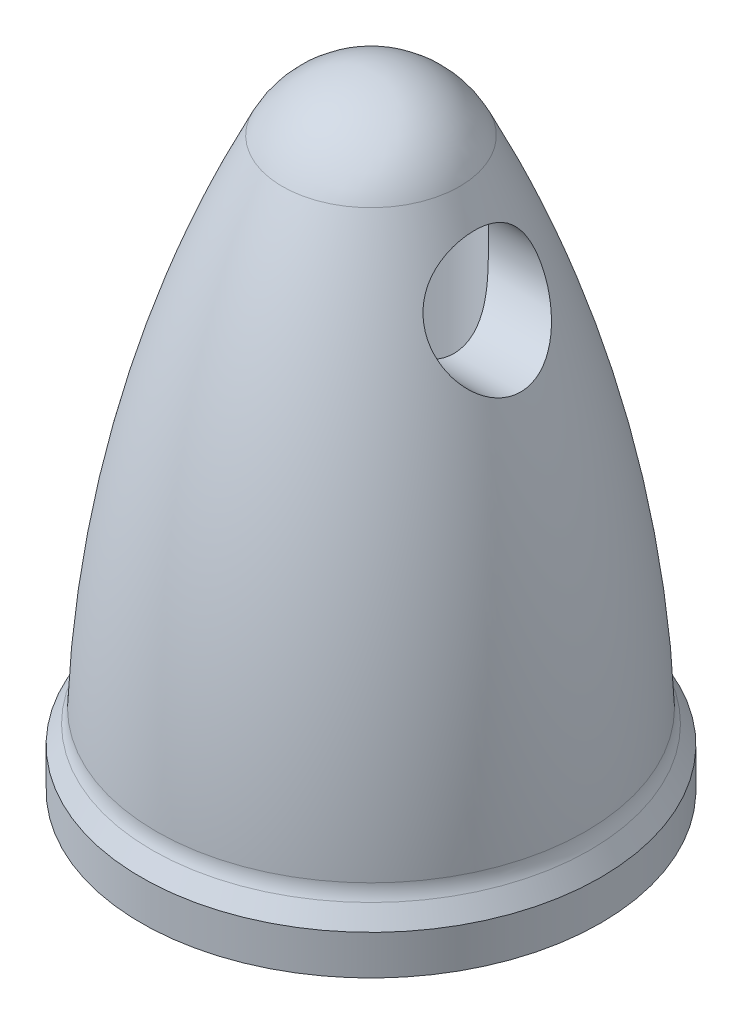
ISO-10303-21;
HEADER;
FILE_DESCRIPTION(('STEP AP214'),'2;1');
FILE_NAME('part.step','',(''),(''),'','','');
FILE_SCHEMA(('AUTOMOTIVE_DESIGN { 1 0 10303 214 1 1 1 1 }'));
ENDSEC;
DATA;
#1=APPLICATION_CONTEXT('core data for automotive mechanical design processes');
#2=APPLICATION_PROTOCOL_DEFINITION('international standard','automotive_design',2000,#1);
#3=PRODUCT_CONTEXT('',#1,'mechanical');
#4=PRODUCT('Part','Part','',(#3));
#5=PRODUCT_RELATED_PRODUCT_CATEGORY('part','',(#4));
#6=PRODUCT_DEFINITION_FORMATION('','',#4);
#7=PRODUCT_DEFINITION_CONTEXT('part definition',#1,'design');
#8=PRODUCT_DEFINITION('design','',#6,#7);
#9=PRODUCT_DEFINITION_SHAPE('','',#8);
#10=(LENGTH_UNIT() NAMED_UNIT(*) SI_UNIT(.MILLI.,.METRE.));
#11=(NAMED_UNIT(*) PLANE_ANGLE_UNIT() SI_UNIT($,.RADIAN.));
#12=(NAMED_UNIT(*) SI_UNIT($,.STERADIAN.) SOLID_ANGLE_UNIT());
#13=UNCERTAINTY_MEASURE_WITH_UNIT(LENGTH_MEASURE(1.E-05),#10,'distance_accuracy_value','');
#14=(GEOMETRIC_REPRESENTATION_CONTEXT(3) GLOBAL_UNCERTAINTY_ASSIGNED_CONTEXT((#13)) GLOBAL_UNIT_ASSIGNED_CONTEXT((#10,
#11,#12)) REPRESENTATION_CONTEXT('',''));
#15=CARTESIAN_POINT('',(0.,0.,0.));
#16=DIRECTION('',(0.,0.,1.));
#17=DIRECTION('',(1.,0.,0.));
#18=AXIS2_PLACEMENT_3D('',#15,#16,#17);
#19=CARTESIAN_POINT('',(5.9055,0.,0.));
#20=DIRECTION('',(0.,-1.,0.));
#21=DIRECTION('',(1.,0.,0.));
#22=AXIS2_PLACEMENT_3D('',#19,#20,#21);
#23=PLANE('',#22);
#24=CARTESIAN_POINT('',(0.,0.,0.));
#25=DIRECTION('',(0.,-1.,0.));
#26=DIRECTION('',(1.,0.,0.));
#27=AXIS2_PLACEMENT_3D('',#24,#25,#26);
#28=CIRCLE('',#27,2.1336);
#29=CARTESIAN_POINT('',(2.1336,0.,0.));
#30=VERTEX_POINT('',#29);
#31=EDGE_CURVE('E142',#30,#30,#28,.T.);
#32=ORIENTED_EDGE('',*,*,#31,.F.);
#33=EDGE_LOOP('',(#32));
#34=FACE_BOUND('',#33,.T.);
#35=CARTESIAN_POINT('',(0.,0.,0.));
#36=DIRECTION('',(0.,-1.,0.));
#37=DIRECTION('',(1.,0.,0.));
#38=AXIS2_PLACEMENT_3D('',#35,#36,#37);
#39=CIRCLE('',#38,5.9055);
#40=CARTESIAN_POINT('',(5.9055,0.,0.));
#41=VERTEX_POINT('',#40);
#42=EDGE_CURVE('E145',#41,#41,#39,.T.);
#43=ORIENTED_EDGE('',*,*,#42,.T.);
#44=EDGE_LOOP('',(#43));
#45=FACE_BOUND('',#44,.T.);
#46=ADVANCED_FACE('F34',(#34,#45),#23,.T.);
#47=CARTESIAN_POINT('',(0.,13.462,0.));
#48=DIRECTION('',(0.,-1.,0.));
#49=DIRECTION('',(1.,0.,0.));
#50=AXIS2_PLACEMENT_3D('',#47,#48,#49);
#51=SPHERICAL_SURFACE('',#50,2.54);
#52=CARTESIAN_POINT('',(0.,14.5837998509104,0.));
#53=DIRECTION('',(0.,-1.,0.));
#54=DIRECTION('',(1.,0.,0.));
#55=AXIS2_PLACEMENT_3D('',#52,#53,#54);
#56=CIRCLE('',#55,2.27885170524483);
#57=CARTESIAN_POINT('',(2.27885170524483,14.5837998509104,0.));
#58=VERTEX_POINT('',#57);
#59=EDGE_CURVE('E80',#58,#58,#56,.T.);
#60=ORIENTED_EDGE('',*,*,#59,.F.);
#61=EDGE_LOOP('',(#60));
#62=FACE_BOUND('',#61,.T.);
#63=ADVANCED_FACE('F129',(#62),#51,.T.);
#64=CARTESIAN_POINT('',(0.,0.5613017145298,0.));
#65=DIRECTION('',(0.,-1.,0.));
#66=DIRECTION('',(1.,0.,0.));
#67=AXIS2_PLACEMENT_3D('',#64,#65,#66);
#68=DEGENERATE_TOROIDAL_SURFACE('',#67,26.2067946103156,31.75,.F.);
#69=CARTESIAN_POINT('',(0.,1.84435599321783,0.));
#70=DIRECTION('',(0.,-1.,0.));
#71=DIRECTION('',(1.,0.,0.));
#72=AXIS2_PLACEMENT_3D('',#69,#70,#71);
#73=CIRCLE('',#72,5.51726994197562);
#74=CARTESIAN_POINT('',(5.51726994197562,1.84435599321783,0.));
#75=VERTEX_POINT('',#74);
#76=EDGE_CURVE('E11',#75,#75,#73,.F.);
#77=ORIENTED_EDGE('',*,*,#76,.T.);
#78=EDGE_LOOP('',(#77));
#79=FACE_BOUND('',#78,.T.);
#80=CARTESIAN_POINT('',(-3.70623269568227,10.9934441874173,-0.74524960081367));
#81=CARTESIAN_POINT('',(-3.73049608134938,10.959059643441,-0.685259641541336));
#82=CARTESIAN_POINT('',(-3.75236292432251,10.9283959647508,-0.622126243018675));
#83=CARTESIAN_POINT('',(-3.79007960465615,10.8758056169061,-0.490585599003258));
#84=CARTESIAN_POINT('',(-3.80592919200305,10.8538793107826,-0.422178134518042));
#85=CARTESIAN_POINT('',(-3.83059439940226,10.8198582353664,-0.281344743460196));
#86=CARTESIAN_POINT('',(-3.8393762261214,10.8078106946583,-0.208901261204926));
#87=CARTESIAN_POINT('',(-3.84907852012478,10.7945042438503,-0.0625191035997228));
#88=CARTESIAN_POINT('',(-3.85000232163198,10.7932407579889,0.0114189242523278));
#89=CARTESIAN_POINT('',(-3.8441177437748,10.8013069173333,0.1536890916008));
#90=CARTESIAN_POINT('',(-3.83779304795704,10.8099739049219,0.222080833461416));
#91=CARTESIAN_POINT('',(-3.81864135282714,10.8363314038793,0.356145987324716));
#92=CARTESIAN_POINT('',(-3.80581325969164,10.8540234331966,0.421818940036647));
#93=CARTESIAN_POINT('',(-3.7741457680848,10.8979830494787,0.550234335295119));
#94=CARTESIAN_POINT('',(-3.75518917668342,10.9244180731983,0.612889766317368));
#95=CARTESIAN_POINT('',(-3.71239785323472,10.9846327574839,0.732742007723939));
#96=CARTESIAN_POINT('',(-3.68856124177456,11.0184152480493,0.789936702566209));
#97=CARTESIAN_POINT('',(-3.63348375237681,11.0973853394872,0.905786273310927));
#98=CARTESIAN_POINT('',(-3.60167383305462,11.1435065707108,0.963531578398175));
#99=CARTESIAN_POINT('',(-3.53458513698183,11.2424591916715,1.07062074615817));
#100=CARTESIAN_POINT('',(-3.49930440810702,11.2952943625299,1.11995983772641));
#101=CARTESIAN_POINT('',(-3.41983123325909,11.4169143714163,1.21837134791156));
#102=CARTESIAN_POINT('',(-3.37520181009775,11.4868379354967,1.26568709712471));
#103=CARTESIAN_POINT('',(-3.28492444164431,11.6331538195193,1.34783692710971));
#104=CARTESIAN_POINT('',(-3.23927535518789,11.7095536852432,1.38265619362951));
#105=CARTESIAN_POINT('',(-3.14309562627013,11.8778787133646,1.44290416659573));
#106=CARTESIAN_POINT('',(-3.09269804867417,11.9705333533547,1.46653371711431));
#107=CARTESIAN_POINT('',(-2.99621160130431,12.1607956487225,1.49579467880649));
#108=CARTESIAN_POINT('',(-2.95011763920919,12.2583972339247,1.5014476299192));
#109=CARTESIAN_POINT('',(-2.875008871208,12.4337909209052,1.49399570561933));
#110=CARTESIAN_POINT('',(-2.84448412873526,12.5111032505574,1.48482235127097));
#111=CARTESIAN_POINT('',(-2.78942608614919,12.6653315952335,1.45388657766073));
#112=CARTESIAN_POINT('',(-2.76488645528343,12.7422479440362,1.43213754315653));
#113=CARTESIAN_POINT('',(-2.72265505050117,12.8936050871113,1.37562575686052));
#114=CARTESIAN_POINT('',(-2.7049957173408,12.968032676436,1.34080283914222));
#115=CARTESIAN_POINT('',(-2.67674138250933,13.111133527504,1.25866723872396));
#116=CARTESIAN_POINT('',(-2.66614689882834,13.1798063669902,1.2113536405705));
#117=CARTESIAN_POINT('',(-2.65153080721651,13.3038804010098,1.10954765288609));
#118=CARTESIAN_POINT('',(-2.64707897992551,13.3598887802364,1.05585081277077));
#119=CARTESIAN_POINT('',(-2.64188214202105,13.4630128947196,0.940357057513348));
#120=CARTESIAN_POINT('',(-2.64113784823812,13.5101269086072,0.87855857833569));
#121=CARTESIAN_POINT('',(-2.64175812499166,13.5959025579871,0.745853762444374));
#122=CARTESIAN_POINT('',(-2.64320754773788,13.6341546187085,0.674683326670559));
#123=CARTESIAN_POINT('',(-2.64671455201356,13.6987387531446,0.527138518866886));
#124=CARTESIAN_POINT('',(-2.64877221549671,13.7250692193458,0.450763446637889));
#125=CARTESIAN_POINT('',(-2.65231915058036,13.7660144242633,0.291314644126676));
#126=CARTESIAN_POINT('',(-2.65377943680958,13.7800628357677,0.208094034813731));
#127=CARTESIAN_POINT('',(-2.65522852615118,13.794012863037,0.0404646099418215));
#128=CARTESIAN_POINT('',(-2.65521734187403,13.7939146000384,-0.0439441954281295));
#129=CARTESIAN_POINT('',(-2.65373165273767,13.77959322667,-0.211346696935822));
#130=CARTESIAN_POINT('',(-2.65226046317562,13.7654021174857,-0.29434316583753));
#131=CARTESIAN_POINT('',(-2.64862896402442,13.7233489517142,-0.456795458866497));
#132=CARTESIAN_POINT('',(-2.6464685139197,13.6954841069177,-0.536250557267413));
#133=CARTESIAN_POINT('',(-2.64288491525602,13.6267258067787,-0.689689371163243));
#134=CARTESIAN_POINT('',(-2.64146454587461,13.5857841596775,-0.763651581121133));
#135=CARTESIAN_POINT('',(-2.64129870828608,13.4920550159141,-0.903658929423185));
#136=CARTESIAN_POINT('',(-2.64255274477847,13.4392697143191,-0.96970553134681));
#137=CARTESIAN_POINT('',(-2.64974964241517,13.3243773303642,-1.09094675708557));
#138=CARTESIAN_POINT('',(-2.65562045762275,13.2624252586768,-1.14629198027818));
#139=CARTESIAN_POINT('',(-2.67360128141926,13.1308410958499,-1.24563865684058));
#140=CARTESIAN_POINT('',(-2.68570722044057,13.0612140373232,-1.28964748122903));
#141=CARTESIAN_POINT('',(-2.71600250963381,12.9212601341637,-1.36298142773331));
#142=CARTESIAN_POINT('',(-2.73378954049913,12.8512184424904,-1.39302128036502));
#143=CARTESIAN_POINT('',(-2.77534923117572,12.709027451596,-1.44183136674358));
#144=CARTESIAN_POINT('',(-2.79912369529522,12.6368775228634,-1.46059819759311));
#145=CARTESIAN_POINT('',(-2.85236129642253,12.4908710438938,-1.48745505152848));
#146=CARTESIAN_POINT('',(-2.88193868478271,12.4170120619696,-1.49529959549135));
#147=CARTESIAN_POINT('',(-2.94514904244868,12.2707169849442,-1.50021400909155));
#148=CARTESIAN_POINT('',(-2.97878343149048,12.1982813983287,-1.49728009619622));
#149=CARTESIAN_POINT('',(-3.05406360958885,12.045133337129,-1.4801578851183));
#150=CARTESIAN_POINT('',(-3.09615230543244,11.9648221295901,-1.4643374725628));
#151=CARTESIAN_POINT('',(-3.18205537732331,11.8085769324935,-1.42026577437626));
#152=CARTESIAN_POINT('',(-3.22587186892094,11.7326486083958,-1.39199878964765));
#153=CARTESIAN_POINT('',(-3.32014398865846,11.5749833238559,-1.31836438684951));
#154=CARTESIAN_POINT('',(-3.37058549738088,11.494145864747,-1.27103708361121));
#155=CARTESIAN_POINT('',(-3.46854368775008,11.3416358365627,-1.16119272817793));
#156=CARTESIAN_POINT('',(-3.51606531688715,11.2699475297518,-1.09870231091732));
#157=CARTESIAN_POINT('',(-3.58752863002465,11.1642875130128,-0.986818420753422));
#158=CARTESIAN_POINT('',(-3.61334947457711,11.1266305103391,-0.942054473100007));
#159=CARTESIAN_POINT('',(-3.66213048316383,11.056189536343,-0.84740490926137));
#160=CARTESIAN_POINT('',(-3.68509133170212,11.0234043986371,-0.797520523822136));
#161=CARTESIAN_POINT('',(-3.70623269568227,10.9934441874173,-0.74524960081367));
#162=B_SPLINE_CURVE_WITH_KNOTS('',3,(#80,#81,#82,#83,#84,#85,#86,#87,#88,#89,#90,#91,#92,#93,
#94,#95,#96,#97,#98,#99,#100,#101,#102,#103,#104,#105,#106,#107,#108,#109,#110,#111,#112,#113,
#114,#115,#116,#117,#118,#119,#120,#121,#122,#123,#124,#125,#126,#127,#128,#129,#130,#131,#132,
#133,#134,#135,#136,#137,#138,#139,#140,#141,#142,#143,#144,#145,#146,#147,#148,#149,#150,#151,
#152,#153,#154,#155,#156,#157,#158,#159,#160,#161),.UNSPECIFIED.,.T.,.F.,(4,2,2,2,2,2,2,2,2,2,2,
2,2,2,2,2,2,2,2,2,2,2,2,2,2,2,2,2,2,2,2,2,2,2,2,2,2,2,2,2,4),(0.,0.21965264765468,
0.439314420755886,0.660020332741697,0.880632592769666,1.08733982869276,1.29408184278535,
1.50503765856381,1.71607487184007,1.95655531371124,2.197171793354,2.48254465708769,
2.7682547140296,3.09095103912461,3.41326055672573,3.66310627316877,3.912686557858,
4.16342977557493,4.4141913755981,4.6463042575775,4.87846201552169,5.11983185553972,
5.36123423229465,5.61325589522014,5.86527539832566,6.11672393626907,6.36822376836555,
6.62066135590659,6.87305219601767,7.1215807428551,7.36994728417743,7.60361864145233,
7.83736049983916,8.07627528000054,8.31527391161513,8.59035207817698,8.86577820439709,
9.18351503431909,9.50069772987495,9.69213310798325,9.88352258004543),.UNSPECIFIED.);
#163=CARTESIAN_POINT('',(-3.70623269568227,10.9934441874173,-0.74524960081367));
#164=VERTEX_POINT('',#163);
#165=EDGE_CURVE('E119',#164,#164,#162,.T.);
#166=ORIENTED_EDGE('',*,*,#165,.F.);
#167=EDGE_LOOP('',(#166));
#168=FACE_BOUND('',#167,.T.);
#169=CARTESIAN_POINT('',(2.66691545767767,13.1801519294185,-1.20823327070742));
#170=CARTESIAN_POINT('',(2.65758141898724,13.245414467892,-1.16033980400675));
#171=CARTESIAN_POINT('',(2.65129254478436,13.3071096890096,-1.10689549104737));
#172=CARTESIAN_POINT('',(2.64334367152019,13.421175965974,-0.990474317539043));
#173=CARTESIAN_POINT('',(2.6416905957235,13.4735329667251,-0.927483347382761));
#174=CARTESIAN_POINT('',(2.64114664077394,13.5671714084083,-0.79400559412982));
#175=CARTESIAN_POINT('',(2.64224833220367,13.6084823071343,-0.723539462081165));
#176=CARTESIAN_POINT('',(2.64542383009648,13.67910821485,-0.576883110773673));
#177=CARTESIAN_POINT('',(2.64749742797203,13.7084257952809,-0.500694122681172));
#178=CARTESIAN_POINT('',(2.6512729076881,13.7550371787799,-0.342113930511586));
#179=CARTESIAN_POINT('',(2.65296118403541,13.7719275933151,-0.259603413284963));
#180=CARTESIAN_POINT('',(2.65496944311631,13.791670672802,-0.0929036099859381));
#181=CARTESIAN_POINT('',(2.6552894411704,13.7945234949316,-0.00871434272096894));
#182=CARTESIAN_POINT('',(2.65440399798543,13.7861074309606,0.15897788734177));
#183=CARTESIAN_POINT('',(2.65319798834581,13.7748332829243,0.24248058274551));
#184=CARTESIAN_POINT('',(2.64987536349743,13.7384798859327,0.406418148723955));
#185=CARTESIAN_POINT('',(2.6477585736147,13.7133979886006,0.486852427599438));
#186=CARTESIAN_POINT('',(2.64392011711497,13.6500575146313,0.642578073538787));
#187=CARTESIAN_POINT('',(2.64219934821893,13.6117694827445,0.717857489367314));
#188=CARTESIAN_POINT('',(2.64100214493266,13.5230914940665,0.860949461401389));
#189=CARTESIAN_POINT('',(2.64152550816178,13.4727026289411,0.928762690357967));
#190=CARTESIAN_POINT('',(2.64686067335808,13.3618899257772,1.05427419803627));
#191=CARTESIAN_POINT('',(2.65163003210993,13.3015702093084,1.11206583854484));
#192=CARTESIAN_POINT('',(2.6671799753391,13.1726675159763,1.21651666489281));
#193=CARTESIAN_POINT('',(2.67795634093979,13.1040903649947,1.26318363107576));
#194=CARTESIAN_POINT('',(2.70567179529704,12.9655330746371,1.34174459105477));
#195=CARTESIAN_POINT('',(2.72221163931588,12.8958720457204,1.37434540983927));
#196=CARTESIAN_POINT('',(2.76145072822521,12.7539481242027,1.42816172062623));
#197=CARTESIAN_POINT('',(2.78415137655534,12.6816846420164,1.4493746151609));
#198=CARTESIAN_POINT('',(2.83512765822185,12.53611785241,1.48073609250577));
#199=CARTESIAN_POINT('',(2.8634452917067,12.4628108291553,1.49079730924459));
#200=CARTESIAN_POINT('',(2.92434054314363,12.3173148883212,1.50018706261158));
#201=CARTESIAN_POINT('',(2.95691982465458,12.2451264197479,1.49951139556126));
#202=CARTESIAN_POINT('',(3.02986431688739,12.0929159153017,1.48733153360608));
#203=CARTESIAN_POINT('',(3.0706787375456,12.0132324574994,1.47430723606958));
#204=CARTESIAN_POINT('',(3.15433216689307,11.8579115801746,1.43610024615172));
#205=CARTESIAN_POINT('',(3.19717304535233,11.7822780401976,1.41090611943774));
#206=CARTESIAN_POINT('',(3.29007923072582,11.6242614810455,1.34398274395343));
#207=CARTESIAN_POINT('',(3.34019700763014,11.5427527872427,1.30024416093702));
#208=CARTESIAN_POINT('',(3.43818728387976,11.3882111436106,1.19777303821602));
#209=CARTESIAN_POINT('',(3.48606038236138,11.3151759243291,1.13904452681367));
#210=CARTESIAN_POINT('',(3.56934175964668,11.1908382721871,1.01783065010906));
#211=CARTESIAN_POINT('',(3.60551041184346,11.1379335068351,0.957514005248416));
#212=CARTESIAN_POINT('',(3.67239747446849,11.0413811683131,0.827225793290532));
#213=CARTESIAN_POINT('',(3.70312300938087,10.9977214794342,0.757267063296565));
#214=CARTESIAN_POINT('',(3.75288348904415,10.9276353720039,0.620400459187242));
#215=CARTESIAN_POINT('',(3.77299451180675,10.8995829237525,0.55471990446916));
#216=CARTESIAN_POINT('',(3.80667441759011,10.8528262858317,0.418506186692723));
#217=CARTESIAN_POINT('',(3.82024669194621,10.8341172499975,0.347975560872648));
#218=CARTESIAN_POINT('',(3.83990844806422,10.8070684894061,0.203574885799819));
#219=CARTESIAN_POINT('',(3.84596405151997,10.7987757096604,0.129691261967633));
#220=CARTESIAN_POINT('',(3.84997442913108,10.7932799195961,-0.0187045951438657));
#221=CARTESIAN_POINT('',(3.84793095803367,10.7960745070862,-0.0932166887681271));
#222=CARTESIAN_POINT('',(3.83639309894397,10.811906614975,-0.234646286725215));
#223=CARTESIAN_POINT('',(3.82748636680356,10.8241363596387,-0.301705879034334));
#224=CARTESIAN_POINT('',(3.80354098969213,10.8571843861555,-0.432510438368969));
#225=CARTESIAN_POINT('',(3.78850149198764,10.878003862377,-0.496254943056119));
#226=CARTESIAN_POINT('',(3.75234162540392,10.9284280085313,-0.622023351996065));
#227=CARTESIAN_POINT('',(3.73096905337064,10.9583990429281,-0.683826196433768));
#228=CARTESIAN_POINT('',(3.68360151703878,11.0255066350261,-0.801457116100382));
#229=CARTESIAN_POINT('',(3.65760444829766,11.0626464556421,-0.857282452573902));
#230=CARTESIAN_POINT('',(3.59779223396342,11.1492146141643,-0.970579120421979));
#231=CARTESIAN_POINT('',(3.56338986196171,11.1996553749255,-1.02696464241089));
#232=CARTESIAN_POINT('',(3.49146449777413,11.3071847963026,-1.13065229110317));
#233=CARTESIAN_POINT('',(3.45393966345653,11.3642773893038,-1.17794900052762));
#234=CARTESIAN_POINT('',(3.37008660200476,11.495047200206,-1.27109940108336));
#235=CARTESIAN_POINT('',(3.32341096817664,11.5698413109203,-1.31507887077776));
#236=CARTESIAN_POINT('',(3.22979178283414,11.7258154175257,-1.38956968978119));
#237=CARTESIAN_POINT('',(3.18284797252545,11.8070031496798,-1.42006441819166));
#238=CARTESIAN_POINT('',(3.08617816964643,11.9831161367176,-1.46921762843692));
#239=CARTESIAN_POINT('',(3.03666235698343,12.0785955897182,-1.48633683411298));
#240=CARTESIAN_POINT('',(2.943272504595,12.2737412535033,-1.50164697630567));
#241=CARTESIAN_POINT('',(2.89938953819462,12.3734004992534,-1.49986824578375));
#242=CARTESIAN_POINT('',(2.83051288937241,12.5484985772928,-1.47869279500378));
#243=CARTESIAN_POINT('',(2.80354509048575,12.6237183374766,-1.4638443866866));
#244=CARTESIAN_POINT('',(2.75581081547832,12.7726835675841,-1.42205239293433));
#245=CARTESIAN_POINT('',(2.73503192824855,12.8464317075864,-1.39513328932416));
#246=CARTESIAN_POINT('',(2.70650888635407,12.9638739486818,-1.34129380936888));
#247=CARTESIAN_POINT('',(2.69677199338774,13.008750166975,-1.31792913097191));
#248=CARTESIAN_POINT('',(2.67992312780911,13.09627638832,-1.26652639937526));
#249=CARTESIAN_POINT('',(2.67281172362075,13.1389259075728,-1.23848733606636));
#250=CARTESIAN_POINT('',(2.66691545767767,13.1801519294185,-1.20823327070742));
#251=B_SPLINE_CURVE_WITH_KNOTS('',3,(#169,#170,#171,#172,#173,#174,#175,#176,#177,#178,#179,
#180,#181,#182,#183,#184,#185,#186,#187,#188,#189,#190,#191,#192,#193,#194,#195,#196,#197,#198,
#199,#200,#201,#202,#203,#204,#205,#206,#207,#208,#209,#210,#211,#212,#213,#214,#215,#216,#217,
#218,#219,#220,#221,#222,#223,#224,#225,#226,#227,#228,#229,#230,#231,#232,#233,#234,#235,#236,
#237,#238,#239,#240,#241,#242,#243,#244,#245,#246,#247,#248,#249,#250),.UNSPECIFIED.,.T.,.F.,(4,
2,2,2,2,2,2,2,2,2,2,2,2,2,2,2,2,2,2,2,2,2,2,2,2,2,2,2,2,2,2,2,2,2,2,2,2,2,2,2,4),(0.,
0.244259639590767,0.488883871360142,0.732849080378543,0.976761954303432,1.22827976444181,
1.47979475834826,1.73140346302251,1.9830604439884,2.23528239522154,2.48748160101706,
2.73718776727473,2.98671877898239,3.22159019801918,3.45651516606174,3.69326788630453,
3.93011330167663,4.20050338873814,4.47114802018742,4.78537403913613,5.09951570363857,
5.36250723035323,5.62515194294633,5.84681376898409,6.06836050556148,6.29090218943141,
6.51339566000842,6.71870500554019,6.92404290815231,7.13901517404934,7.35408551754276,
7.6024881230262,7.8510383298046,8.14541963946029,8.4401627903699,8.76520955145166,
9.08973466089549,9.33255618248402,9.57488742474971,9.72915164855361,9.8834492513335),.UNSPECIFIED.);
#252=CARTESIAN_POINT('',(2.66691545767767,13.1801519294185,-1.20823327070742));
#253=VERTEX_POINT('',#252);
#254=EDGE_CURVE('E114',#253,#253,#251,.T.);
#255=ORIENTED_EDGE('',*,*,#254,.F.);
#256=EDGE_LOOP('',(#255));
#257=FACE_BOUND('',#256,.T.);
#258=ORIENTED_EDGE('',*,*,#59,.T.);
#259=EDGE_LOOP('',(#258));
#260=FACE_BOUND('',#259,.T.);
#261=ADVANCED_FACE('F123',(#79,#168,#257,#260),#68,.F.);
#262=CARTESIAN_POINT('',(0.,1.016,0.));
#263=DIRECTION('',(0.,-1.,0.));
#264=DIRECTION('',(1.,0.,0.));
#265=AXIS2_PLACEMENT_3D('',#262,#263,#264);
#266=CONICAL_SURFACE('',#265,5.9055,0.540419500270599);
#267=CARTESIAN_POINT('',(0.,1.48310353027056,0.));
#268=DIRECTION('',(0.,-1.,0.));
#269=DIRECTION('',(1.,0.,0.));
#270=AXIS2_PLACEMENT_3D('',#267,#268,#269);
#271=CIRCLE('',#270,5.62523788183766);
#272=CARTESIAN_POINT('',(5.62523788183765,1.48310353027056,0.));
#273=VERTEX_POINT('',#272);
#274=EDGE_CURVE('E42',#273,#273,#271,.T.);
#275=ORIENTED_EDGE('',*,*,#274,.T.);
#276=EDGE_LOOP('',(#275));
#277=FACE_BOUND('',#276,.T.);
#278=CARTESIAN_POINT('',(0.,1.016,0.));
#279=DIRECTION('',(0.,-1.,0.));
#280=DIRECTION('',(1.,0.,0.));
#281=AXIS2_PLACEMENT_3D('',#278,#279,#280);
#282=CIRCLE('',#281,5.9055);
#283=CARTESIAN_POINT('',(5.9055,1.016,0.));
#284=VERTEX_POINT('',#283);
#285=EDGE_CURVE('E147',#284,#284,#282,.T.);
#286=ORIENTED_EDGE('',*,*,#285,.F.);
#287=EDGE_LOOP('',(#286));
#288=FACE_BOUND('',#287,.T.);
#289=ADVANCED_FACE('F128',(#277,#288),#266,.T.);
#290=CARTESIAN_POINT('',(0.,16.002,0.));
#291=DIRECTION('',(0.,-1.,0.));
#292=DIRECTION('',(1.,0.,0.));
#293=AXIS2_PLACEMENT_3D('',#290,#291,#292);
#294=CYLINDRICAL_SURFACE('',#293,5.9055);
#295=ORIENTED_EDGE('',*,*,#285,.T.);
#296=EDGE_LOOP('',(#295));
#297=FACE_BOUND('',#296,.T.);
#298=ORIENTED_EDGE('',*,*,#42,.F.);
#299=EDGE_LOOP('',(#298));
#300=FACE_BOUND('',#299,.T.);
#301=ADVANCED_FACE('F198',(#297,#300),#294,.T.);
#302=CARTESIAN_POINT('',(0.,14.224,0.));
#303=DIRECTION('',(0.,-1.,0.));
#304=DIRECTION('',(1.,0.,0.));
#305=AXIS2_PLACEMENT_3D('',#302,#303,#304);
#306=CYLINDRICAL_SURFACE('',#305,2.1336);
#307=CARTESIAN_POINT('',(0.,13.0508242530067,0.));
#308=DIRECTION('',(0.,-1.,0.));
#309=DIRECTION('',(1.,0.,0.));
#310=AXIS2_PLACEMENT_3D('',#307,#308,#309);
#311=CIRCLE('',#310,2.1336);
#312=CARTESIAN_POINT('',(1.69700782831196,13.0508242530044,-1.29321823010116));
#313=VERTEX_POINT('',#312);
#314=CARTESIAN_POINT('',(-1.69700782830885,13.0508242530067,-1.29321823009826));
#315=VERTEX_POINT('',#314);
#316=EDGE_CURVE('E67',#313,#315,#311,.F.);
#317=ORIENTED_EDGE('',*,*,#316,.T.);
#318=CARTESIAN_POINT('',(-1.69700782830885,13.0508242530067,-1.29321823009826));
#319=CARTESIAN_POINT('',(-1.67098465951903,12.9924406178855,-1.32740015149563));
#320=CARTESIAN_POINT('',(-1.64602245667483,12.9311590734272,-1.35796999551949));
#321=CARTESIAN_POINT('',(-1.60065768319788,12.8028385903914,-1.41115689387925));
#322=CARTESIAN_POINT('',(-1.58030721742719,12.7357446639811,-1.43368457816181));
#323=CARTESIAN_POINT('',(-1.54714647087601,12.5965581941237,-1.46942230409397));
#324=CARTESIAN_POINT('',(-1.53439964802111,12.5244290447527,-1.48255410639058));
#325=CARTESIAN_POINT('',(-1.51934373351307,12.3783042056053,-1.49799064269273));
#326=CARTESIAN_POINT('',(-1.51697267834894,12.3043222575614,-1.50035965474199));
#327=CARTESIAN_POINT('',(-1.52257887321044,12.1680329605008,-1.49465749586752));
#328=CARTESIAN_POINT('',(-1.52910119499763,12.1055926083378,-1.48805465934561));
#329=CARTESIAN_POINT('',(-1.54895547389336,11.9829643076193,-1.46737474547632));
#330=CARTESIAN_POINT('',(-1.56230584696603,11.922782925376,-1.453277450719));
#331=CARTESIAN_POINT('',(-1.59932191475999,11.7866634606064,-1.41258382225797));
#332=CARTESIAN_POINT('',(-1.62493521316652,11.7120388360711,-1.38340347580704));
#333=CARTESIAN_POINT('',(-1.68107621440721,11.5698169130962,-1.31461140150294));
#334=CARTESIAN_POINT('',(-1.71161049719707,11.5022292258985,-1.27498566115332));
#335=CARTESIAN_POINT('',(-1.77507697090685,11.3728951122367,-1.18509732960499));
#336=CARTESIAN_POINT('',(-1.80805000201642,11.3113367102402,-1.13459381737199));
#337=CARTESIAN_POINT('',(-1.8728163052955,11.1966834598697,-1.02416024059906));
#338=CARTESIAN_POINT('',(-1.90461032264314,11.1435831932174,-0.964236260097282));
#339=CARTESIAN_POINT('',(-1.96317257514333,11.0490479858948,-0.838334507003393));
#340=CARTESIAN_POINT('',(-1.99010160434052,11.0071987523109,-0.772745347127166));
#341=CARTESIAN_POINT('',(-2.03847032378968,10.9335689739115,-0.634238685006358));
#342=CARTESIAN_POINT('',(-2.05991190933163,10.9017849518031,-0.561323725145453));
#343=CARTESIAN_POINT('',(-2.09548170616979,10.8496597451854,-0.409088537521825));
#344=CARTESIAN_POINT('',(-2.10955183047483,10.8294093398122,-0.329722965267856));
#345=CARTESIAN_POINT('',(-2.12855695079689,10.802155697454,-0.167700239222158));
#346=CARTESIAN_POINT('',(-2.1335009042333,10.7951394708547,-0.0850463944079894));
#347=CARTESIAN_POINT('',(-2.13368315332346,10.7948830083363,0.0690487402889634));
#348=CARTESIAN_POINT('',(-2.13014445517594,10.7999068448269,0.140493573253503));
#349=CARTESIAN_POINT('',(-2.11616126730821,10.8199164873591,0.281268861459781));
#350=CARTESIAN_POINT('',(-2.10571641130141,10.8349028217887,0.350599204349826));
#351=CARTESIAN_POINT('',(-2.07899293423569,10.8737551201138,0.484388379175313));
#352=CARTESIAN_POINT('',(-2.06279926606717,10.8974919603065,0.548902410264416));
#353=CARTESIAN_POINT('',(-2.02572716872751,10.9528740279552,0.672959870836522));
#354=CARTESIAN_POINT('',(-2.00484791955817,10.9845206397679,0.732502427783185));
#355=CARTESIAN_POINT('',(-1.95672097523954,11.0594031972717,0.853382862392613));
#356=CARTESIAN_POINT('',(-1.92899659033845,11.1036169777981,0.913922600532945));
#357=CARTESIAN_POINT('',(-1.87114266752204,11.1998863744376,1.02719498618933));
#358=CARTESIAN_POINT('',(-1.84100972721437,11.2519531793722,1.07991627810572));
#359=CARTESIAN_POINT('',(-1.77507480187919,11.37301507505,1.18570245248768));
#360=CARTESIAN_POINT('',(-1.73921351877539,11.4433752449809,1.23717612276346));
#361=CARTESIAN_POINT('',(-1.67108063619429,11.5932383359927,1.32775850205019));
#362=CARTESIAN_POINT('',(-1.63880510989291,11.6727310577974,1.36688082549161));
#363=CARTESIAN_POINT('',(-1.59105768215348,11.8159449940867,1.42186884771623));
#364=CARTESIAN_POINT('',(-1.57342372139543,11.8776095417067,1.44118762139053));
#365=CARTESIAN_POINT('',(-1.54477908488423,12.0043239697415,1.47185324319773));
#366=CARTESIAN_POINT('',(-1.53375491615935,12.0693666569965,1.48321633975259));
#367=CARTESIAN_POINT('',(-1.52004056472953,12.2017972566055,1.4972750882752));
#368=CARTESIAN_POINT('',(-1.51741305474285,12.2691990264259,1.49990556553633));
#369=CARTESIAN_POINT('',(-1.52118848961479,12.4035074059,1.49607448980543));
#370=CARTESIAN_POINT('',(-1.52759552668456,12.4704137773608,1.48960881670203));
#371=CARTESIAN_POINT('',(-1.54725254015282,12.5952581906168,1.46915941684423));
#372=CARTESIAN_POINT('',(-1.55979433978119,12.6534442663736,1.45594855524074));
#373=CARTESIAN_POINT('',(-1.58974397165148,12.7667044611182,1.42318399818715));
#374=CARTESIAN_POINT('',(-1.60715533228847,12.8217762886628,1.40362570184711));
#375=CARTESIAN_POINT('',(-1.63712045041026,12.905591506736,1.36834599434956));
#376=CARTESIAN_POINT('',(-1.64858655768122,12.9355622813001,1.35453588940073));
#377=CARTESIAN_POINT('',(-1.67228256826124,12.994166597404,1.32517008083164));
#378=CARTESIAN_POINT('',(-1.68450944969743,13.0228047273842,1.30962110956751));
#379=CARTESIAN_POINT('',(-1.69700782830885,13.0508242530067,1.29321823009826));
#380=B_SPLINE_CURVE_WITH_KNOTS('',3,(#318,#319,#320,#321,#322,#323,#324,#325,#326,#327,#328,
#329,#330,#331,#332,#333,#334,#335,#336,#337,#338,#339,#340,#341,#342,#343,#344,#345,#346,#347,
#348,#349,#350,#351,#352,#353,#354,#355,#356,#357,#358,#359,#360,#361,#362,#363,#364,#365,#366,
#367,#368,#369,#370,#371,#372,#373,#374,#375,#376,#377,#378,#379),.UNSPECIFIED.,.F.,.F.,(4,2,2,
2,2,2,2,2,2,2,2,2,2,2,2,2,2,2,2,2,2,2,2,2,2,2,2,2,2,2,4),(0.,0.217697599217093,0.43774416528714,
0.659602379804697,0.880133845316538,1.06859063973776,1.25755842339492,1.50856416939653,
1.75990836856313,2.01752937421946,2.27498467842233,2.52097068769153,2.76687162165848,
3.01468216338077,3.26224934721789,3.47631077501408,3.69038355704264,3.90141624974771,
4.11248590298355,4.3513811371439,4.59062001689054,4.87220838789477,5.1534852819887,
5.35370369639585,5.55351198872654,5.75480820986868,5.95619563771846,6.13844441356137,
6.32082558719928,6.42556276628318,6.52990762521572),.UNSPECIFIED.);
#381=CARTESIAN_POINT('',(-1.69700782831195,13.0508242530044,1.29321823010116));
#382=VERTEX_POINT('',#381);
#383=EDGE_CURVE('E55',#315,#382,#380,.T.);
#384=ORIENTED_EDGE('',*,*,#383,.T.);
#385=CARTESIAN_POINT('',(1.69700782830885,13.0508242530067,1.29321823009826));
#386=VERTEX_POINT('',#385);
#387=EDGE_CURVE('E73',#382,#386,#311,.F.);
#388=ORIENTED_EDGE('',*,*,#387,.T.);
#389=CARTESIAN_POINT('',(1.69700782830885,13.0508242530067,1.29321823009826));
#390=CARTESIAN_POINT('',(1.67098465951903,12.9924406178855,1.32740015149563));
#391=CARTESIAN_POINT('',(1.64602245667483,12.9311590734272,1.35796999551949));
#392=CARTESIAN_POINT('',(1.60065768319788,12.8028385903914,1.41115689387925));
#393=CARTESIAN_POINT('',(1.58030721742719,12.7357446639811,1.43368457816181));
#394=CARTESIAN_POINT('',(1.54714647087601,12.5965581941237,1.46942230409397));
#395=CARTESIAN_POINT('',(1.53439964802111,12.5244290447527,1.48255410639058));
#396=CARTESIAN_POINT('',(1.51934373351307,12.3783042056053,1.49799064269273));
#397=CARTESIAN_POINT('',(1.51697267834894,12.3043222575614,1.50035965474199));
#398=CARTESIAN_POINT('',(1.52257887321044,12.1680329605008,1.49465749586752));
#399=CARTESIAN_POINT('',(1.52910119499763,12.1055926083378,1.48805465934561));
#400=CARTESIAN_POINT('',(1.54895547389336,11.9829643076193,1.46737474547632));
#401=CARTESIAN_POINT('',(1.56230584696603,11.922782925376,1.453277450719));
#402=CARTESIAN_POINT('',(1.59932191475999,11.7866634606064,1.41258382225797));
#403=CARTESIAN_POINT('',(1.62493521316652,11.7120388360711,1.38340347580704));
#404=CARTESIAN_POINT('',(1.68107621440721,11.5698169130962,1.31461140150294));
#405=CARTESIAN_POINT('',(1.71161049719707,11.5022292258985,1.27498566115332));
#406=CARTESIAN_POINT('',(1.77507697090685,11.3728951122367,1.18509732960499));
#407=CARTESIAN_POINT('',(1.80805000201642,11.3113367102402,1.13459381737199));
#408=CARTESIAN_POINT('',(1.8728163052955,11.1966834598697,1.02416024059906));
#409=CARTESIAN_POINT('',(1.90461032264314,11.1435831932174,0.964236260097282));
#410=CARTESIAN_POINT('',(1.96317257514333,11.0490479858948,0.838334507003393));
#411=CARTESIAN_POINT('',(1.99010160434052,11.0071987523109,0.772745347127166));
#412=CARTESIAN_POINT('',(2.03847032378968,10.9335689739115,0.634238685006357));
#413=CARTESIAN_POINT('',(2.05991190933163,10.9017849518031,0.561323725145452));
#414=CARTESIAN_POINT('',(2.09548170616979,10.8496597451854,0.409088537521824));
#415=CARTESIAN_POINT('',(2.10955183047483,10.8294093398122,0.329722965267855));
#416=CARTESIAN_POINT('',(2.12855695079689,10.802155697454,0.167700239222157));
#417=CARTESIAN_POINT('',(2.1335009042333,10.7951394708547,0.0850463944079883));
#418=CARTESIAN_POINT('',(2.13368315332346,10.7948830083363,-0.0690487402889647));
#419=CARTESIAN_POINT('',(2.13014445517594,10.7999068448269,-0.140493573253504));
#420=CARTESIAN_POINT('',(2.11616126730821,10.8199164873591,-0.281268861459782));
#421=CARTESIAN_POINT('',(2.10571641130141,10.8349028217887,-0.350599204349827));
#422=CARTESIAN_POINT('',(2.07899293423569,10.8737551201138,-0.484388379175314));
#423=CARTESIAN_POINT('',(2.06279926606717,10.8974919603065,-0.548902410264417));
#424=CARTESIAN_POINT('',(2.02572716872751,10.9528740279552,-0.672959870836522));
#425=CARTESIAN_POINT('',(2.00484791955818,10.9845206397679,-0.732502427783186));
#426=CARTESIAN_POINT('',(1.95672097523954,11.0594031972717,-0.853382862392615));
#427=CARTESIAN_POINT('',(1.92899659033846,11.1036169777981,-0.913922600532946));
#428=CARTESIAN_POINT('',(1.87114266752204,11.1998863744376,-1.02719498618933));
#429=CARTESIAN_POINT('',(1.84100972721437,11.2519531793722,-1.07991627810572));
#430=CARTESIAN_POINT('',(1.77507480187919,11.37301507505,-1.18570245248768));
#431=CARTESIAN_POINT('',(1.73921351877539,11.4433752449809,-1.23717612276346));
#432=CARTESIAN_POINT('',(1.67108063619429,11.5932383359927,-1.32775850205019));
#433=CARTESIAN_POINT('',(1.63880510989291,11.6727310577974,-1.36688082549161));
#434=CARTESIAN_POINT('',(1.59105768215348,11.8159449940867,-1.42186884771623));
#435=CARTESIAN_POINT('',(1.57342372139543,11.8776095417067,-1.44118762139052));
#436=CARTESIAN_POINT('',(1.54477908488423,12.0043239697415,-1.47185324319773));
#437=CARTESIAN_POINT('',(1.53375491615935,12.0693666569965,-1.48321633975259));
#438=CARTESIAN_POINT('',(1.52004056472954,12.2017972566055,-1.4972750882752));
#439=CARTESIAN_POINT('',(1.51741305474285,12.2691990264259,-1.49990556553633));
#440=CARTESIAN_POINT('',(1.52118848961479,12.4035074059,-1.49607448980543));
#441=CARTESIAN_POINT('',(1.52759552668456,12.4704137773608,-1.48960881670203));
#442=CARTESIAN_POINT('',(1.54725254015282,12.5952581906168,-1.46915941684423));
#443=CARTESIAN_POINT('',(1.5597943397812,12.6534442663736,-1.45594855524074));
#444=CARTESIAN_POINT('',(1.58974397165148,12.7667044611182,-1.42318399818715));
#445=CARTESIAN_POINT('',(1.60715533228848,12.8217762886628,-1.40362570184711));
#446=CARTESIAN_POINT('',(1.63712045041026,12.905591506736,-1.36834599434956));
#447=CARTESIAN_POINT('',(1.64858655768122,12.9355622813001,-1.35453588940073));
#448=CARTESIAN_POINT('',(1.67228256826124,12.994166597404,-1.32517008083165));
#449=CARTESIAN_POINT('',(1.68450944969743,13.0228047273842,-1.30962110956751));
#450=CARTESIAN_POINT('',(1.69700782830885,13.0508242530067,-1.29321823009826));
#451=B_SPLINE_CURVE_WITH_KNOTS('',3,(#389,#390,#391,#392,#393,#394,#395,#396,#397,#398,#399,
#400,#401,#402,#403,#404,#405,#406,#407,#408,#409,#410,#411,#412,#413,#414,#415,#416,#417,#418,
#419,#420,#421,#422,#423,#424,#425,#426,#427,#428,#429,#430,#431,#432,#433,#434,#435,#436,#437,
#438,#439,#440,#441,#442,#443,#444,#445,#446,#447,#448,#449,#450),.UNSPECIFIED.,.F.,.F.,(4,2,2,
2,2,2,2,2,2,2,2,2,2,2,2,2,2,2,2,2,2,2,2,2,2,2,2,2,2,2,4),(0.,0.217697599217093,0.43774416528714,
0.6596023798047,0.880133845316538,1.06859063973776,1.25755842339492,1.50856416939653,
1.75990836856313,2.01752937421946,2.27498467842233,2.52097068769153,2.76687162165848,
3.01468216338077,3.26224934721789,3.47631077501408,3.69038355704265,3.90141624974771,
4.11248590298356,4.3513811371439,4.59062001689054,4.87220838789477,5.1534852819887,
5.35370369639585,5.55351198872654,5.75480820986868,5.95619563771846,6.13844441356138,
6.32082558719928,6.42556276628318,6.52990762521572),.UNSPECIFIED.);
#452=EDGE_CURVE('E48',#386,#313,#451,.T.);
#453=ORIENTED_EDGE('',*,*,#452,.T.);
#454=EDGE_LOOP('',(#317,#384,#388,#453));
#455=FACE_BOUND('',#454,.T.);
#456=ORIENTED_EDGE('',*,*,#31,.T.);
#457=EDGE_LOOP('',(#456));
#458=FACE_BOUND('',#457,.T.);
#459=ADVANCED_FACE('F71',(#455,#458),#306,.F.);
#460=CARTESIAN_POINT('',(0.,14.224,0.));
#461=DIRECTION('',(0.,-1.,0.));
#462=DIRECTION('',(1.,0.,0.));
#463=AXIS2_PLACEMENT_3D('',#460,#461,#462);
#464=PLANE('',#463);
#465=CARTESIAN_POINT('',(0.,14.224,0.));
#466=DIRECTION('',(0.,-1.,0.));
#467=DIRECTION('',(1.,0.,0.));
#468=AXIS2_PLACEMENT_3D('',#465,#466,#467);
#469=CIRCLE('',#468,0.101600000000014);
#470=CARTESIAN_POINT('',(0.101600000000015,14.224,0.));
#471=VERTEX_POINT('',#470);
#472=EDGE_CURVE('E77',#471,#471,#469,.T.);
#473=ORIENTED_EDGE('',*,*,#472,.T.);
#474=EDGE_LOOP('',(#473));
#475=FACE_BOUND('',#474,.T.);
#476=ADVANCED_FACE('F98',(#475),#464,.T.);
#477=CARTESIAN_POINT('',(0.,14.224,0.));
#478=DIRECTION('',(0.,-1.,0.));
#479=DIRECTION('',(1.,0.,0.));
#480=AXIS2_PLACEMENT_3D('',#477,#478,#479);
#481=CONICAL_SURFACE('',#480,0.101600000000014,1.04719755119659);
#482=ORIENTED_EDGE('',*,*,#316,.F.);
#483=CARTESIAN_POINT('',(2.78123948566979,12.4612123722425,-1.48919711679523));
#484=CARTESIAN_POINT('',(2.70123299420738,12.5032328807488,-1.48444619454533));
#485=CARTESIAN_POINT('',(2.62136407615793,12.5453484411751,-1.47792477528737));
#486=CARTESIAN_POINT('',(2.46205488510863,12.6298556947204,-1.46103065526624));
#487=CARTESIAN_POINT('',(2.38261527457047,12.6722476677049,-1.45065313924153));
#488=CARTESIAN_POINT('',(2.2230509612584,12.7580788289186,-1.42551550959047));
#489=CARTESIAN_POINT('',(2.14294096167377,12.8015228380581,-1.41067753507466));
#490=CARTESIAN_POINT('',(1.98398207385482,12.8887310444466,-1.37616296390639));
#491=CARTESIAN_POINT('',(1.90513251068079,12.932495050704,-1.35648905601212));
#492=CARTESIAN_POINT('',(1.77700297470135,13.0048548917821,-1.31944341242095));
#493=CARTESIAN_POINT('',(1.72716664967614,13.0333177588057,-1.30373550386491));
#494=CARTESIAN_POINT('',(1.62857513834033,13.0904781791975,-1.26960488655167));
#495=CARTESIAN_POINT('',(1.57981969852404,13.1191756753287,-1.25118282227762));
#496=CARTESIAN_POINT('',(1.48399045033604,13.176752131571,-1.2112259846987));
#497=CARTESIAN_POINT('',(1.43691075594084,13.2056299257968,-1.18970380479787));
#498=CARTESIAN_POINT('',(1.34492669724666,13.2637088832589,-1.14284015868345));
#499=CARTESIAN_POINT('',(1.30002058256465,13.292909762221,-1.11750183557564));
#500=CARTESIAN_POINT('',(1.21413976079428,13.3511710969846,-1.06250947521535));
#501=CARTESIAN_POINT('',(1.17311267464069,13.3802260078631,-1.03293299284589));
#502=CARTESIAN_POINT('',(1.09594179359642,13.438439929297,-0.968008690111314));
#503=CARTESIAN_POINT('',(1.05979088201386,13.4675987229694,-0.932669450626865));
#504=CARTESIAN_POINT('',(1.00036483025685,13.5204261977863,-0.861575647223316));
#505=CARTESIAN_POINT('',(0.975947722991141,13.5441989084078,-0.82687489579259));
#506=CARTESIAN_POINT('',(0.933939475779101,13.5901799328051,-0.752709811319609));
#507=CARTESIAN_POINT('',(0.916332291734242,13.612391821474,-0.713256965597014));
#508=CARTESIAN_POINT('',(0.888335540305728,13.653860146565,-0.630576509754042));
#509=CARTESIAN_POINT('',(0.877932316828482,13.6731221206442,-0.587356217504862));
#510=CARTESIAN_POINT('',(0.862802814080999,13.7077304152583,-0.49832947434169));
#511=CARTESIAN_POINT('',(0.858097065524629,13.7230624187827,-0.452514289654167));
#512=CARTESIAN_POINT('',(0.85257891383155,13.7470100193279,-0.367437466585399));
#513=CARTESIAN_POINT('',(0.851237956117114,13.7563260520096,-0.328396425176528));
#514=CARTESIAN_POINT('',(0.84968407160454,13.7718035851411,-0.249652629079244));
#515=CARTESIAN_POINT('',(0.849471791215346,13.7779632760866,-0.209949508262116));
#516=CARTESIAN_POINT('',(0.849347966557986,13.787083992906,-0.130099739023644));
#517=CARTESIAN_POINT('',(0.849437021399927,13.790038631132,-0.0899523653957243));
#518=CARTESIAN_POINT('',(0.849512311977863,13.7927088434757,-0.00956229484206557));
#519=CARTESIAN_POINT('',(0.849498580006377,13.7924254348752,0.0306803681749004));
#520=CARTESIAN_POINT('',(0.84940514458896,13.7885749194507,0.112037278779583));
#521=CARTESIAN_POINT('',(0.849323768119234,13.7849242786157,0.153147589762816));
#522=CARTESIAN_POINT('',(0.849616186642827,13.774242484129,0.234952142214528));
#523=CARTESIAN_POINT('',(0.849990255241895,13.7672092999718,0.275646118757426));
#524=CARTESIAN_POINT('',(0.852185392125838,13.7498545328948,0.356102101405409));
#525=CARTESIAN_POINT('',(0.853999630606319,13.7395486085523,0.395867596652675));
#526=CARTESIAN_POINT('',(0.860401566893951,13.7157896581398,0.474184542966122));
#527=CARTESIAN_POINT('',(0.864985498418149,13.7023409209308,0.512737568008461));
#528=CARTESIAN_POINT('',(0.879738486125832,13.6695542001738,0.595750376528402));
#529=CARTESIAN_POINT('',(0.890857738929938,13.6495743226265,0.639806486310994));
#530=CARTESIAN_POINT('',(0.920630943379034,13.6067164286353,0.723704565837445));
#531=CARTESIAN_POINT('',(0.939273115364406,13.5838429813126,0.763553001600583));
#532=CARTESIAN_POINT('',(0.983337577131328,13.5367855006423,0.837992474065762));
#533=CARTESIAN_POINT('',(1.00872541207619,13.5126086115511,0.872608863055522));
#534=CARTESIAN_POINT('',(1.0646962974316,13.4637847256551,0.937077042370491));
#535=CARTESIAN_POINT('',(1.09529478528117,13.43913653095,0.966914148177765));
#536=CARTESIAN_POINT('',(1.15959513431052,13.3902556759554,1.02200068438212));
#537=CARTESIAN_POINT('',(1.19324679761716,13.3660220822835,1.04730920583426));
#538=CARTESIAN_POINT('',(1.26298571929674,13.3177456050877,1.09456188467689));
#539=CARTESIAN_POINT('',(1.29907544952822,13.2937029435925,1.11650255151562));
#540=CARTESIAN_POINT('',(1.40997744886956,13.2218507767564,1.17820572538528));
#541=CARTESIAN_POINT('',(1.48733537000893,13.1743804248994,1.21378156138212));
#542=CARTESIAN_POINT('',(1.60901830956519,13.1019825546598,1.26223305542349));
#543=CARTESIAN_POINT('',(1.65210728342525,13.0767645583454,1.27800653848331));
#544=CARTESIAN_POINT('',(1.73910708872896,13.0265020577154,1.30748178323099));
#545=CARTESIAN_POINT('',(1.78301804552237,13.0014575806721,1.32118322599897));
#546=CARTESIAN_POINT('',(1.89983398039794,12.9354879349711,1.35495596575921));
#547=CARTESIAN_POINT('',(1.97325841869169,12.8946875273778,1.37347103073244));
#548=CARTESIAN_POINT('',(2.12121840336937,12.8133819621893,1.40625187422805));
#549=CARTESIAN_POINT('',(2.19575430909583,12.7728769066738,1.42051624577143));
#550=CARTESIAN_POINT('',(2.42074157270098,12.6515688846389,1.45768659377297));
#551=CARTESIAN_POINT('',(2.57234407826663,12.5711001592291,1.47490777280382));
#552=CARTESIAN_POINT('',(2.80120021203123,12.4506787285629,1.4908951969549));
#553=CARTESIAN_POINT('',(2.87802226815039,12.410432860828,1.49457861917756));
#554=CARTESIAN_POINT('',(3.03186185542423,12.3301223963412,1.49869550886926));
#555=CARTESIAN_POINT('',(3.10887939383469,12.2900578064761,1.49912885388576));
#556=CARTESIAN_POINT('',(3.26261750324218,12.210302228819,1.49681284868328));
#557=CARTESIAN_POINT('',(3.33933785239324,12.1706103711723,1.49407780053024));
#558=CARTESIAN_POINT('',(3.4927020327697,12.091442695152,1.48543345356119));
#559=CARTESIAN_POINT('',(3.5693458704055,12.0519668571713,1.47952444782382));
#560=CARTESIAN_POINT('',(3.64589578999268,12.0126073064603,1.47202074244126));
#561=B_SPLINE_CURVE_WITH_KNOTS('',3,(#483,#484,#485,#486,#487,#488,#489,#490,#491,#492,#493,
#494,#495,#496,#497,#498,#499,#500,#501,#502,#503,#504,#505,#506,#507,#508,#509,#510,#511,#512,
#513,#514,#515,#516,#517,#518,#519,#520,#521,#522,#523,#524,#525,#526,#527,#528,#529,#530,#531,
#532,#533,#534,#535,#536,#537,#538,#539,#540,#541,#542,#543,#544,#545,#546,#547,#548,#549,#550,
#551,#552,#553,#554,#555,#556,#557,#558,#559,#560),.UNSPECIFIED.,.F.,.F.,(4,2,2,2,2,2,2,2,2,2,2,
2,2,2,2,2,2,2,2,2,2,2,2,2,2,2,2,2,2,2,2,2,2,2,2,2,2,2,4),(0.,0.271490422858727,
0.543321012209749,0.820203214658629,1.09693181863221,1.27538159510474,1.45378906631436,
1.63149123813422,1.80904784080025,1.98369382010786,2.1580820830258,2.30336353443867,
2.44830058860778,2.59296213703346,2.7381434330586,2.8584737181617,2.97887291064777,
3.09951161950792,3.22011242891149,3.34378796845245,3.46753784196551,3.59070432996061,
3.71370370949959,3.8618478367305,4.00976088907487,4.15693250370509,4.30454797634953,
4.45006879237194,4.5957394269819,4.8874591136294,5.04451318471671,5.20159140436951,
5.45949196065844,5.71747778742041,6.23425234295675,6.49462537411342,6.75500821524561,
7.01422025816876,7.27340836994239),.UNSPECIFIED.);
#562=EDGE_CURVE('E66',#313,#386,#561,.T.);
#563=ORIENTED_EDGE('',*,*,#562,.T.);
#564=ORIENTED_EDGE('',*,*,#387,.F.);
#565=CARTESIAN_POINT('',(-2.78123948566981,12.4612123722425,1.48919711679523));
#566=CARTESIAN_POINT('',(-2.70123299420728,12.5032328807489,1.48444619454532));
#567=CARTESIAN_POINT('',(-2.6213640761577,12.5453484411753,1.47792477528735));
#568=CARTESIAN_POINT('',(-2.46205488510816,12.6298556947207,1.46103065526618));
#569=CARTESIAN_POINT('',(-2.38261527456987,12.6722476677052,1.45065313924144));
#570=CARTESIAN_POINT('',(-2.22305096125756,12.7580788289191,1.42551550959032));
#571=CARTESIAN_POINT('',(-2.1429409616728,12.8015228380587,1.41067753507447));
#572=CARTESIAN_POINT('',(-1.9839820738536,12.8887310444473,1.3761629639061));
#573=CARTESIAN_POINT('',(-1.90513251067945,12.9324950507048,1.35648905601178));
#574=CARTESIAN_POINT('',(-1.77700297469994,13.0048548917829,1.31944341242051));
#575=CARTESIAN_POINT('',(-1.72716664967477,13.0333177588065,1.30373550386447));
#576=CARTESIAN_POINT('',(-1.62857513833905,13.0904781791983,1.2696048865512));
#577=CARTESIAN_POINT('',(-1.57981969852281,13.1191756753295,1.25118282227714));
#578=CARTESIAN_POINT('',(-1.4839904503349,13.1767521315717,1.21122598469819));
#579=CARTESIAN_POINT('',(-1.43691075593975,13.2056299257975,1.18970380479735));
#580=CARTESIAN_POINT('',(-1.34492669724568,13.2637088832595,1.14284015868291));
#581=CARTESIAN_POINT('',(-1.30002058256372,13.2929097622216,1.11750183557509));
#582=CARTESIAN_POINT('',(-1.21413976079346,13.3511710969852,1.06250947521478));
#583=CARTESIAN_POINT('',(-1.17311267463993,13.3802260078636,1.03293299284531));
#584=CARTESIAN_POINT('',(-1.09594179359578,13.4384399292975,0.968008690110714));
#585=CARTESIAN_POINT('',(-1.05979088201328,13.4675987229699,0.932669450626257));
#586=CARTESIAN_POINT('',(-1.00036483025638,13.5204261977868,0.861575647222685));
#587=CARTESIAN_POINT('',(-0.975947722990715,13.5441989084082,0.826874895791941));
#588=CARTESIAN_POINT('',(-0.933939475778769,13.5901799328055,0.752709811318928));
#589=CARTESIAN_POINT('',(-0.916332291733959,13.6123918214744,0.71325696559632));
#590=CARTESIAN_POINT('',(-0.888335540305535,13.6538601465653,0.630576509753335));
#591=CARTESIAN_POINT('',(-0.877932316828329,13.6731221206445,0.587356217504156));
#592=CARTESIAN_POINT('',(-0.862802814080912,13.7077304152585,0.498329474340993));
#593=CARTESIAN_POINT('',(-0.858097065524567,13.723062418783,0.45251428965348));
#594=CARTESIAN_POINT('',(-0.852578913831518,13.7470100193281,0.3674374665847));
#595=CARTESIAN_POINT('',(-0.851237956117091,13.7563260520098,0.328396425175803));
#596=CARTESIAN_POINT('',(-0.849684071604531,13.7718035851413,0.249652629078471));
#597=CARTESIAN_POINT('',(-0.849471791215341,13.7779632760867,0.20994950826132));
#598=CARTESIAN_POINT('',(-0.849347966557986,13.787083992906,0.130099739022802));
#599=CARTESIAN_POINT('',(-0.849437021399927,13.7900386311321,0.0899523653948595));
#600=CARTESIAN_POINT('',(-0.849512311977862,13.7927088434757,0.00956229484115759));
#601=CARTESIAN_POINT('',(-0.849498580006375,13.7924254348752,-0.030680368175829));
#602=CARTESIAN_POINT('',(-0.849405144588957,13.7885749194507,-0.112037278780544));
#603=CARTESIAN_POINT('',(-0.849323768119232,13.7849242786156,-0.153147589763788));
#604=CARTESIAN_POINT('',(-0.849616186642833,13.7742424841288,-0.234952142215519));
#605=CARTESIAN_POINT('',(-0.849990255241908,13.7672092999717,-0.275646118758426));
#606=CARTESIAN_POINT('',(-0.852185392125877,13.7498545328945,-0.356102101406422));
#607=CARTESIAN_POINT('',(-0.853999630606376,13.739548608552,-0.395867596653691));
#608=CARTESIAN_POINT('',(-0.860401566894057,13.7157896581395,-0.47418454296714));
#609=CARTESIAN_POINT('',(-0.864985498418287,13.7023409209305,-0.512737568009477));
#610=CARTESIAN_POINT('',(-0.879738486126055,13.6695542001733,-0.595750376529392));
#611=CARTESIAN_POINT('',(-0.890857738930213,13.649574322626,-0.639806486311959));
#612=CARTESIAN_POINT('',(-0.920630943379419,13.6067164286348,-0.723704565838351));
#613=CARTESIAN_POINT('',(-0.939273115364849,13.5838429813121,-0.763553001601455));
#614=CARTESIAN_POINT('',(-0.983337577131872,13.5367855006417,-0.83799247406656));
#615=CARTESIAN_POINT('',(-1.00872541207678,13.5126086115505,-0.87260886305628));
#616=CARTESIAN_POINT('',(-1.06469629743226,13.4637847256545,-0.937077042371174));
#617=CARTESIAN_POINT('',(-1.09529478528186,13.4391365309495,-0.966914148178413));
#618=CARTESIAN_POINT('',(-1.15959513431133,13.3902556759548,-1.02200068438276));
#619=CARTESIAN_POINT('',(-1.19324679761807,13.3660220822829,-1.04730920583493));
#620=CARTESIAN_POINT('',(-1.26298571929786,13.3177456050869,-1.0945618846776));
#621=CARTESIAN_POINT('',(-1.29907544952943,13.2937029435917,-1.11650255151634));
#622=CARTESIAN_POINT('',(-1.40997744887108,13.2218507767555,-1.17820572538603));
#623=CARTESIAN_POINT('',(-1.48733537001065,13.1743804248984,-1.21378156138288));
#624=CARTESIAN_POINT('',(-1.60901830956657,13.101982554659,-1.262233055424));
#625=CARTESIAN_POINT('',(-1.65210728342608,13.0767645583449,-1.27800653848359));
#626=CARTESIAN_POINT('',(-1.73910708872866,13.0265020577156,-1.30748178323089));
#627=CARTESIAN_POINT('',(-1.78301804552149,13.0014575806726,-1.3211832259987));
#628=CARTESIAN_POINT('',(-1.89983398039652,12.9354879349719,-1.35495596575883));
#629=CARTESIAN_POINT('',(-1.97325841869032,12.8946875273786,-1.37347103073211));
#630=CARTESIAN_POINT('',(-2.12121840336809,12.81338196219,-1.40625187422779));
#631=CARTESIAN_POINT('',(-2.1957543090946,12.7728769066745,-1.42051624577121));
#632=CARTESIAN_POINT('',(-2.42074157269989,12.6515688846395,-1.45768659377283));
#633=CARTESIAN_POINT('',(-2.57234407826565,12.5711001592296,-1.47490777280373));
#634=CARTESIAN_POINT('',(-2.80120021203043,12.4506787285634,-1.49089519695485));
#635=CARTESIAN_POINT('',(-2.87802226814966,12.4104328608284,-1.49457861917753));
#636=CARTESIAN_POINT('',(-3.03186185542365,12.3301223963415,-1.49869550886925));
#637=CARTESIAN_POINT('',(-3.10887939383419,12.2900578064764,-1.49912885388576));
#638=CARTESIAN_POINT('',(-3.26261750324182,12.2103022288192,-1.49681284868329));
#639=CARTESIAN_POINT('',(-3.33933785239296,12.1706103711725,-1.49407780053025));
#640=CARTESIAN_POINT('',(-3.49270203276956,12.0914426951521,-1.48543345356121));
#641=CARTESIAN_POINT('',(-3.56934587040543,12.0519668571713,-1.47952444782383));
#642=CARTESIAN_POINT('',(-3.64589578999268,12.0126073064603,-1.47202074244126));
#643=B_SPLINE_CURVE_WITH_KNOTS('',3,(#565,#566,#567,#568,#569,#570,#571,#572,#573,#574,#575,
#576,#577,#578,#579,#580,#581,#582,#583,#584,#585,#586,#587,#588,#589,#590,#591,#592,#593,#594,
#595,#596,#597,#598,#599,#600,#601,#602,#603,#604,#605,#606,#607,#608,#609,#610,#611,#612,#613,
#614,#615,#616,#617,#618,#619,#620,#621,#622,#623,#624,#625,#626,#627,#628,#629,#630,#631,#632,
#633,#634,#635,#636,#637,#638,#639,#640,#641,#642),.UNSPECIFIED.,.F.,.F.,(4,2,2,2,2,2,2,2,2,2,2,
2,2,2,2,2,2,2,2,2,2,2,2,2,2,2,2,2,2,2,2,2,2,2,2,2,2,2,4),(0.,0.271490422859145,
0.543321012210586,0.820203214659921,1.09693181863396,1.27538159510635,1.45378906631584,
1.63149123813557,1.80904784080147,1.98369382010893,2.15808208302673,2.30336353443955,
2.44830058860862,2.59296213703423,2.73814343305932,2.85847371816248,2.97887291064861,
3.09951161950882,3.22011242891245,3.34378796845346,3.46753784196655,3.59070432996169,
3.71370370950071,3.86184783673162,4.009760889076,4.15693250370621,4.30454797635064,
4.45006879237336,4.59573942698365,4.88745911363179,5.04451318471704,5.2015914043678,
5.45949196065691,5.71747778741906,6.23425234295578,6.49462537411271,6.75500821524514,
7.01422025816854,7.27340836994241),.UNSPECIFIED.);
#644=EDGE_CURVE('E60',#382,#315,#643,.T.);
#645=ORIENTED_EDGE('',*,*,#644,.T.);
#646=EDGE_LOOP('',(#482,#563,#564,#645));
#647=FACE_BOUND('',#646,.T.);
#648=ORIENTED_EDGE('',*,*,#472,.F.);
#649=EDGE_LOOP('',(#648));
#650=FACE_BOUND('',#649,.T.);
#651=ADVANCED_FACE('F75',(#647,#650),#481,.F.);
#652=CARTESIAN_POINT('',(-5.9055,12.2936,0.));
#653=DIRECTION('',(1.,0.,0.));
#654=DIRECTION('',(0.,0.,-1.));
#655=AXIS2_PLACEMENT_3D('',#652,#653,#654);
#656=CYLINDRICAL_SURFACE('',#655,1.4986);
#657=ORIENTED_EDGE('',*,*,#165,.T.);
#658=EDGE_LOOP('',(#657));
#659=FACE_BOUND('',#658,.T.);
#660=ORIENTED_EDGE('',*,*,#644,.F.);
#661=ORIENTED_EDGE('',*,*,#383,.F.);
#662=EDGE_LOOP('',(#660,#661));
#663=FACE_BOUND('',#662,.T.);
#664=ADVANCED_FACE('F61',(#659,#663),#656,.F.);
#665=ORIENTED_EDGE('',*,*,#254,.T.);
#666=EDGE_LOOP('',(#665));
#667=FACE_BOUND('',#666,.T.);
#668=ORIENTED_EDGE('',*,*,#562,.F.);
#669=ORIENTED_EDGE('',*,*,#452,.F.);
#670=EDGE_LOOP('',(#668,#669));
#671=FACE_BOUND('',#670,.T.);
#672=ADVANCED_FACE('F93',(#667,#671),#656,.F.);
#673=CARTESIAN_POINT('',(0.,1.87514929590634,0.));
#674=DIRECTION('',(0.,-1.,0.));
#675=DIRECTION('',(1.,0.,0.));
#676=AXIS2_PLACEMENT_3D('',#673,#674,#675);
#677=TOROIDAL_SURFACE('',#676,6.27864749123061,0.762);
#678=ORIENTED_EDGE('',*,*,#76,.F.);
#679=EDGE_LOOP('',(#678));
#680=FACE_BOUND('',#679,.T.);
#681=ORIENTED_EDGE('',*,*,#274,.F.);
#682=EDGE_LOOP('',(#681));
#683=FACE_BOUND('',#682,.T.);
#684=ADVANCED_FACE('F36',(#680,#683),#677,.F.);
#685=CLOSED_SHELL('',(#46,#63,#261,#289,#301,#459,#476,#651,#664,#672,#684));
#686=MANIFOLD_SOLID_BREP('B2',#685);
#687=ADVANCED_BREP_SHAPE_REPRESENTATION('',(#18,#686),#14);
#688=SHAPE_DEFINITION_REPRESENTATION(#9,#687);
ENDSEC;
END-ISO-10303-21;
